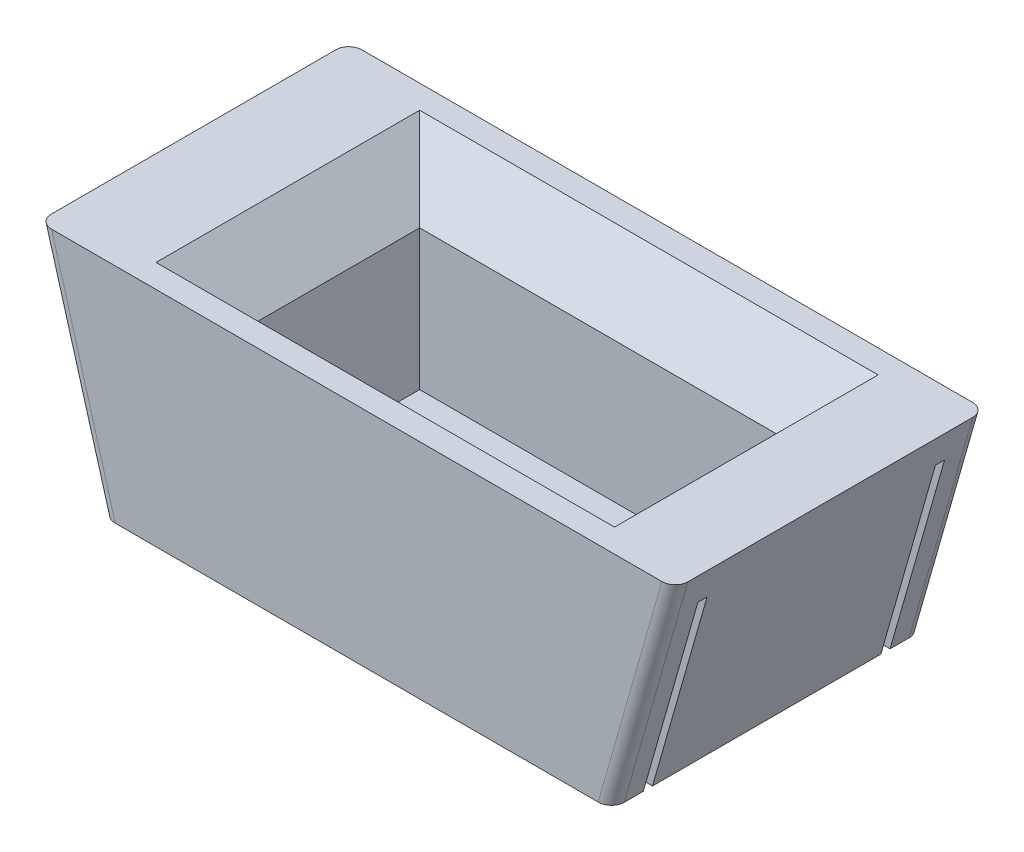
ISO-10303-21;
HEADER;
FILE_DESCRIPTION(('STEP AP214'),'2;1');
FILE_NAME('part.step','',(''),(''),'','','');
FILE_SCHEMA(('AUTOMOTIVE_DESIGN { 1 0 10303 214 1 1 1 1 }'));
ENDSEC;
DATA;
#1=APPLICATION_CONTEXT('core data for automotive mechanical design processes');
#2=APPLICATION_PROTOCOL_DEFINITION('international standard','automotive_design',2000,#1);
#3=PRODUCT_CONTEXT('',#1,'mechanical');
#4=PRODUCT('Part','Part','',(#3));
#5=PRODUCT_RELATED_PRODUCT_CATEGORY('part','',(#4));
#6=PRODUCT_DEFINITION_FORMATION('','',#4);
#7=PRODUCT_DEFINITION_CONTEXT('part definition',#1,'design');
#8=PRODUCT_DEFINITION('design','',#6,#7);
#9=PRODUCT_DEFINITION_SHAPE('','',#8);
#10=(LENGTH_UNIT() NAMED_UNIT(*) SI_UNIT(.MILLI.,.METRE.));
#11=(NAMED_UNIT(*) PLANE_ANGLE_UNIT() SI_UNIT($,.RADIAN.));
#12=(NAMED_UNIT(*) SI_UNIT($,.STERADIAN.) SOLID_ANGLE_UNIT());
#13=UNCERTAINTY_MEASURE_WITH_UNIT(LENGTH_MEASURE(1.E-05),#10,'distance_accuracy_value','');
#14=(GEOMETRIC_REPRESENTATION_CONTEXT(3) GLOBAL_UNCERTAINTY_ASSIGNED_CONTEXT((#13)) GLOBAL_UNIT_ASSIGNED_CONTEXT((#10,
#11,#12)) REPRESENTATION_CONTEXT('',''));
#15=CARTESIAN_POINT('',(0.,0.,0.));
#16=DIRECTION('',(0.,0.,1.));
#17=DIRECTION('',(1.,0.,0.));
#18=AXIS2_PLACEMENT_3D('',#15,#16,#17);
#19=CARTESIAN_POINT('',(0.,0.,0.));
#20=DIRECTION('',(0.,1.,0.));
#21=DIRECTION('',(0.,0.,1.));
#22=AXIS2_PLACEMENT_3D('',#19,#20,#21);
#23=PLANE('',#22);
#24=DIRECTION('',(0.,0.,1.));
#25=VECTOR('',#24,1.);
#26=CARTESIAN_POINT('',(-7.7566470171623,0.,11.5914147439107));
#27=LINE('',#26,#25);
#28=CARTESIAN_POINT('',(-7.7566470171623,0.,-14.1314147439107));
#29=VERTEX_POINT('',#28);
#30=CARTESIAN_POINT('',(-7.7566470171623,0.,14.1314147439107));
#31=VERTEX_POINT('',#30);
#32=EDGE_CURVE('E495',#29,#31,#27,.T.);
#33=ORIENTED_EDGE('',*,*,#32,.T.);
#34=DIRECTION('',(1.,0.,0.));
#35=VECTOR('',#34,1.);
#36=CARTESIAN_POINT('',(0.,0.,14.1314147439107));
#37=LINE('',#36,#35);
#38=CARTESIAN_POINT('',(32.766,0.,14.1314147439107));
#39=VERTEX_POINT('',#38);
#40=EDGE_CURVE('E498',#31,#39,#37,.T.);
#41=ORIENTED_EDGE('',*,*,#40,.T.);
#42=DIRECTION('',(0.,0.,-1.));
#43=VECTOR('',#42,1.);
#44=CARTESIAN_POINT('',(32.766,0.,0.));
#45=LINE('',#44,#43);
#46=CARTESIAN_POINT('',(32.766,0.,-14.1314147439107));
#47=VERTEX_POINT('',#46);
#48=EDGE_CURVE('E492',#39,#47,#45,.T.);
#49=ORIENTED_EDGE('',*,*,#48,.T.);
#50=DIRECTION('',(-1.,0.,0.));
#51=VECTOR('',#50,1.);
#52=CARTESIAN_POINT('',(-5.21664701716227,0.,-14.1314147439107));
#53=LINE('',#52,#51);
#54=EDGE_CURVE('E489',#47,#29,#53,.T.);
#55=ORIENTED_EDGE('',*,*,#54,.T.);
#56=EDGE_LOOP('',(#33,#41,#49,#55));
#57=FACE_BOUND('',#56,.T.);
#58=DIRECTION('',(1.,0.,0.));
#59=VECTOR('',#58,1.);
#60=CARTESIAN_POINT('',(0.,0.,22.7711));
#61=LINE('',#60,#59);
#62=CARTESIAN_POINT('',(-50.7954767943513,0.,22.7711));
#63=VERTEX_POINT('',#62);
#64=CARTESIAN_POINT('',(50.7954767943513,0.,22.7711));
#65=VERTEX_POINT('',#64);
#66=EDGE_CURVE('E328',#63,#65,#61,.T.);
#67=ORIENTED_EDGE('',*,*,#66,.F.);
#68=DIRECTION('',(0.,0.,1.));
#69=VECTOR('',#68,1.);
#70=CARTESIAN_POINT('',(-50.7954767943513,0.,-30.9626));
#71=LINE('',#70,#69);
#72=CARTESIAN_POINT('',(-50.7954767943513,0.,-22.7711));
#73=VERTEX_POINT('',#72);
#74=EDGE_CURVE('E538',#73,#63,#71,.T.);
#75=ORIENTED_EDGE('',*,*,#74,.F.);
#76=DIRECTION('',(1.,0.,0.));
#77=VECTOR('',#76,1.);
#78=CARTESIAN_POINT('',(0.,0.,-22.7711));
#79=LINE('',#78,#77);
#80=CARTESIAN_POINT('',(50.7954767943513,0.,-22.7711));
#81=VERTEX_POINT('',#80);
#82=EDGE_CURVE('E350',#73,#81,#79,.T.);
#83=ORIENTED_EDGE('',*,*,#82,.T.);
#84=DIRECTION('',(0.,0.,1.));
#85=VECTOR('',#84,1.);
#86=CARTESIAN_POINT('',(50.7954767943513,0.,-30.9626));
#87=LINE('',#86,#85);
#88=EDGE_CURVE('E543',#81,#65,#87,.T.);
#89=ORIENTED_EDGE('',*,*,#88,.T.);
#90=EDGE_LOOP('',(#67,#75,#83,#89));
#91=FACE_BOUND('',#90,.T.);
#92=ADVANCED_FACE('F77',(#57,#91),#23,.F.);
#93=DIRECTION('',(1.,0.,0.));
#94=VECTOR('',#93,1.);
#95=CARTESIAN_POINT('',(0.,0.,30.9626));
#96=LINE('',#95,#94);
#97=CARTESIAN_POINT('',(-48.1537659016846,0.,30.9626));
#98=VERTEX_POINT('',#97);
#99=CARTESIAN_POINT('',(48.1537659016846,0.,30.9626));
#100=VERTEX_POINT('',#99);
#101=EDGE_CURVE('E349',#98,#100,#96,.T.);
#102=ORIENTED_EDGE('',*,*,#101,.F.);
#103=CARTESIAN_POINT('',(-48.1537659016846,0.,28.4226));
#104=DIRECTION('',(0.,1.,0.));
#105=DIRECTION('',(-1.,0.,0.));
#106=AXIS2_PLACEMENT_3D('',#103,#104,#105);
#107=ELLIPSE('',#106,2.64171089266669,2.54);
#108=CARTESIAN_POINT('',(-50.7954767943513,0.,28.4226));
#109=VERTEX_POINT('',#108);
#110=EDGE_CURVE('E466',#98,#109,#107,.F.);
#111=ORIENTED_EDGE('',*,*,#110,.T.);
#112=CARTESIAN_POINT('',(-50.7954767943513,0.,24.6126));
#113=VERTEX_POINT('',#112);
#114=EDGE_CURVE('E539',#113,#109,#71,.T.);
#115=ORIENTED_EDGE('',*,*,#114,.F.);
#116=DIRECTION('',(1.,0.,0.));
#117=VECTOR('',#116,1.);
#118=CARTESIAN_POINT('',(0.,0.,24.6126));
#119=LINE('',#118,#117);
#120=CARTESIAN_POINT('',(50.7954767943513,0.,24.6126));
#121=VERTEX_POINT('',#120);
#122=EDGE_CURVE('E362',#113,#121,#119,.T.);
#123=ORIENTED_EDGE('',*,*,#122,.T.);
#124=CARTESIAN_POINT('',(50.7954767943513,0.,28.4226));
#125=VERTEX_POINT('',#124);
#126=EDGE_CURVE('E533',#121,#125,#87,.T.);
#127=ORIENTED_EDGE('',*,*,#126,.T.);
#128=CARTESIAN_POINT('',(48.1537659016846,0.,28.4226));
#129=DIRECTION('',(0.,1.,0.));
#130=DIRECTION('',(-1.,0.,0.));
#131=AXIS2_PLACEMENT_3D('',#128,#129,#130);
#132=ELLIPSE('',#131,2.64171089266669,2.54);
#133=EDGE_CURVE('E463',#125,#100,#132,.F.);
#134=ORIENTED_EDGE('',*,*,#133,.T.);
#135=EDGE_LOOP('',(#102,#111,#115,#123,#127,#134));
#136=FACE_BOUND('',#135,.T.);
#137=ADVANCED_FACE('F595',(#136),#23,.F.);
#138=CARTESIAN_POINT('',(0.,44.45,-30.9626));
#139=DIRECTION('',(0.,0.,-1.));
#140=DIRECTION('',(-1.,0.,0.));
#141=AXIS2_PLACEMENT_3D('',#138,#139,#140);
#142=PLANE('',#141);
#143=DIRECTION('',(1.,0.,0.));
#144=VECTOR('',#143,1.);
#145=CARTESIAN_POINT('',(0.,0.,-30.9626));
#146=LINE('',#145,#144);
#147=CARTESIAN_POINT('',(-48.1537659016846,0.,-30.9626));
#148=VERTEX_POINT('',#147);
#149=CARTESIAN_POINT('',(48.1537659016846,0.,-30.9626));
#150=VERTEX_POINT('',#149);
#151=EDGE_CURVE('E377',#148,#150,#146,.T.);
#152=ORIENTED_EDGE('',*,*,#151,.F.);
#153=DIRECTION('',(-0.27481158389579,0.961498098467536,0.));
#154=VECTOR('',#153,1.);
#155=CARTESIAN_POINT('',(-61.0577948298924,45.1480214230953,-30.9626));
#156=LINE('',#155,#154);
#157=CARTESIAN_POINT('',(-60.8582891073333,44.45,-30.9626));
#158=VERTEX_POINT('',#157);
#159=EDGE_CURVE('E472',#148,#158,#156,.T.);
#160=ORIENTED_EDGE('',*,*,#159,.T.);
#161=DIRECTION('',(1.,0.,0.));
#162=VECTOR('',#161,1.);
#163=CARTESIAN_POINT('',(0.,44.45,-30.9626));
#164=LINE('',#163,#162);
#165=CARTESIAN_POINT('',(60.8582891073333,44.45,-30.9626));
#166=VERTEX_POINT('',#165);
#167=EDGE_CURVE('E376',#158,#166,#164,.T.);
#168=ORIENTED_EDGE('',*,*,#167,.T.);
#169=DIRECTION('',(0.274811583895791,0.961498098467536,0.));
#170=VECTOR('',#169,1.);
#171=CARTESIAN_POINT('',(56.2621855080421,28.3693646482017,-30.9626));
#172=LINE('',#171,#170);
#173=EDGE_CURVE('E469',#166,#150,#172,.F.);
#174=ORIENTED_EDGE('',*,*,#173,.T.);
#175=EDGE_LOOP('',(#152,#160,#168,#174));
#176=FACE_BOUND('',#175,.T.);
#177=ADVANCED_FACE('F643',(#176),#142,.T.);
#178=CARTESIAN_POINT('',(-50.7954767943513,0.,-28.4226));
#179=VERTEX_POINT('',#178);
#180=CARTESIAN_POINT('',(-50.7954767943513,0.,-24.6126));
#181=VERTEX_POINT('',#180);
#182=EDGE_CURVE('E534',#179,#181,#71,.T.);
#183=ORIENTED_EDGE('',*,*,#182,.F.);
#184=CARTESIAN_POINT('',(-48.1537659016846,0.,-28.4226));
#185=DIRECTION('',(0.,1.,0.));
#186=DIRECTION('',(1.,0.,0.));
#187=AXIS2_PLACEMENT_3D('',#184,#185,#186);
#188=ELLIPSE('',#187,2.64171089266669,2.54);
#189=EDGE_CURVE('E479',#179,#148,#188,.F.);
#190=ORIENTED_EDGE('',*,*,#189,.T.);
#191=ORIENTED_EDGE('',*,*,#151,.T.);
#192=CARTESIAN_POINT('',(48.1537659016846,0.,-28.4226));
#193=DIRECTION('',(0.,1.,0.));
#194=DIRECTION('',(1.,0.,0.));
#195=AXIS2_PLACEMENT_3D('',#192,#193,#194);
#196=ELLIPSE('',#195,2.64171089266669,2.54);
#197=CARTESIAN_POINT('',(50.7954767943513,0.,-28.4226));
#198=VERTEX_POINT('',#197);
#199=EDGE_CURVE('E476',#150,#198,#196,.F.);
#200=ORIENTED_EDGE('',*,*,#199,.T.);
#201=CARTESIAN_POINT('',(50.7954767943513,0.,-24.6126));
#202=VERTEX_POINT('',#201);
#203=EDGE_CURVE('E540',#198,#202,#87,.T.);
#204=ORIENTED_EDGE('',*,*,#203,.T.);
#205=DIRECTION('',(1.,0.,0.));
#206=VECTOR('',#205,1.);
#207=CARTESIAN_POINT('',(0.,0.,-24.6126));
#208=LINE('',#207,#206);
#209=EDGE_CURVE('E345',#181,#202,#208,.T.);
#210=ORIENTED_EDGE('',*,*,#209,.F.);
#211=EDGE_LOOP('',(#183,#190,#191,#200,#204,#210));
#212=FACE_BOUND('',#211,.T.);
#213=ADVANCED_FACE('F633',(#212),#23,.F.);
#214=CARTESIAN_POINT('',(0.,44.45,30.9626));
#215=DIRECTION('',(0.,0.,-1.));
#216=DIRECTION('',(-1.,0.,0.));
#217=AXIS2_PLACEMENT_3D('',#214,#215,#216);
#218=PLANE('',#217);
#219=DIRECTION('',(1.,0.,0.));
#220=VECTOR('',#219,1.);
#221=CARTESIAN_POINT('',(0.,44.45,30.9626));
#222=LINE('',#221,#220);
#223=CARTESIAN_POINT('',(-60.8582891073333,44.45,30.9626));
#224=VERTEX_POINT('',#223);
#225=CARTESIAN_POINT('',(60.8582891073333,44.45,30.9626));
#226=VERTEX_POINT('',#225);
#227=EDGE_CURVE('E389',#224,#226,#222,.T.);
#228=ORIENTED_EDGE('',*,*,#227,.F.);
#229=DIRECTION('',(-0.27481158389579,0.961498098467536,0.));
#230=VECTOR('',#229,1.);
#231=CARTESIAN_POINT('',(-56.2621855080421,28.3693646482018,30.9626));
#232=LINE('',#231,#230);
#233=EDGE_CURVE('E460',#224,#98,#232,.F.);
#234=ORIENTED_EDGE('',*,*,#233,.T.);
#235=ORIENTED_EDGE('',*,*,#101,.T.);
#236=DIRECTION('',(0.274811583895791,0.961498098467536,0.));
#237=VECTOR('',#236,1.);
#238=CARTESIAN_POINT('',(61.0577948298925,45.1480214230953,30.9626));
#239=LINE('',#238,#237);
#240=EDGE_CURVE('E456',#100,#226,#239,.T.);
#241=ORIENTED_EDGE('',*,*,#240,.T.);
#242=EDGE_LOOP('',(#228,#234,#235,#241));
#243=FACE_BOUND('',#242,.T.);
#244=ADVANCED_FACE('F603',(#243),#218,.F.);
#245=CARTESIAN_POINT('',(0.,38.1,22.7711));
#246=DIRECTION('',(0.,0.,-1.));
#247=DIRECTION('',(-1.,0.,0.));
#248=AXIS2_PLACEMENT_3D('',#245,#246,#247);
#249=PLANE('',#248);
#250=DIRECTION('',(1.,0.,0.));
#251=VECTOR('',#250,1.);
#252=CARTESIAN_POINT('',(0.,38.1,22.7711));
#253=LINE('',#252,#251);
#254=CARTESIAN_POINT('',(-61.6850681134787,38.1,22.7711));
#255=VERTEX_POINT('',#254);
#256=CARTESIAN_POINT('',(61.6850681134788,38.1,22.7711));
#257=VERTEX_POINT('',#256);
#258=EDGE_CURVE('E358',#255,#257,#253,.T.);
#259=ORIENTED_EDGE('',*,*,#258,.F.);
#260=DIRECTION('',(0.27481158389579,-0.961498098467536,0.));
#261=VECTOR('',#260,1.);
#262=CARTESIAN_POINT('',(-57.0265250006602,21.8009041572915,22.7711));
#263=LINE('',#262,#261);
#264=EDGE_CURVE('E303',#255,#63,#263,.T.);
#265=ORIENTED_EDGE('',*,*,#264,.T.);
#266=ORIENTED_EDGE('',*,*,#66,.T.);
#267=DIRECTION('',(-0.274811583895791,-0.961498098467536,0.));
#268=VECTOR('',#267,1.);
#269=CARTESIAN_POINT('',(57.0265250006602,21.8009041572915,22.7711));
#270=LINE('',#269,#268);
#271=EDGE_CURVE('E558',#257,#65,#270,.T.);
#272=ORIENTED_EDGE('',*,*,#271,.F.);
#273=EDGE_LOOP('',(#259,#265,#266,#272));
#274=FACE_BOUND('',#273,.T.);
#275=ADVANCED_FACE('F582',(#274),#249,.F.);
#276=CARTESIAN_POINT('',(0.,38.1,24.6126));
#277=DIRECTION('',(0.,0.,-1.));
#278=DIRECTION('',(-1.,0.,0.));
#279=AXIS2_PLACEMENT_3D('',#276,#277,#278);
#280=PLANE('',#279);
#281=DIRECTION('',(0.27481158389579,-0.961498098467536,0.));
#282=VECTOR('',#281,1.);
#283=CARTESIAN_POINT('',(-57.0265250006602,21.8009041572915,24.6126));
#284=LINE('',#283,#282);
#285=CARTESIAN_POINT('',(-61.6850681134787,38.1,24.6126));
#286=VERTEX_POINT('',#285);
#287=EDGE_CURVE('E571',#286,#113,#284,.T.);
#288=ORIENTED_EDGE('',*,*,#287,.F.);
#289=DIRECTION('',(1.,0.,0.));
#290=VECTOR('',#289,1.);
#291=CARTESIAN_POINT('',(0.,38.1,24.6126));
#292=LINE('',#291,#290);
#293=CARTESIAN_POINT('',(61.6850681134788,38.1,24.6126));
#294=VERTEX_POINT('',#293);
#295=EDGE_CURVE('E354',#286,#294,#292,.T.);
#296=ORIENTED_EDGE('',*,*,#295,.T.);
#297=DIRECTION('',(-0.274811583895791,-0.961498098467536,0.));
#298=VECTOR('',#297,1.);
#299=CARTESIAN_POINT('',(57.0265250006602,21.8009041572915,24.6126));
#300=LINE('',#299,#298);
#301=EDGE_CURVE('E554',#294,#121,#300,.T.);
#302=ORIENTED_EDGE('',*,*,#301,.T.);
#303=ORIENTED_EDGE('',*,*,#122,.F.);
#304=EDGE_LOOP('',(#288,#296,#302,#303));
#305=FACE_BOUND('',#304,.T.);
#306=ADVANCED_FACE('F749',(#305),#280,.T.);
#307=CARTESIAN_POINT('',(0.,38.1,0.));
#308=DIRECTION('',(0.,1.,0.));
#309=DIRECTION('',(0.,0.,1.));
#310=AXIS2_PLACEMENT_3D('',#307,#308,#309);
#311=PLANE('',#310);
#312=ORIENTED_EDGE('',*,*,#295,.F.);
#313=DIRECTION('',(0.,0.,-1.));
#314=VECTOR('',#313,1.);
#315=CARTESIAN_POINT('',(-61.6850681134787,38.1,0.));
#316=LINE('',#315,#314);
#317=EDGE_CURVE('E568',#286,#255,#316,.T.);
#318=ORIENTED_EDGE('',*,*,#317,.T.);
#319=ORIENTED_EDGE('',*,*,#258,.T.);
#320=DIRECTION('',(0.,0.,-1.));
#321=VECTOR('',#320,1.);
#322=CARTESIAN_POINT('',(61.6850681134788,38.1,0.));
#323=LINE('',#322,#321);
#324=EDGE_CURVE('E551',#294,#257,#323,.T.);
#325=ORIENTED_EDGE('',*,*,#324,.F.);
#326=EDGE_LOOP('',(#312,#318,#319,#325));
#327=FACE_BOUND('',#326,.T.);
#328=ADVANCED_FACE('F746',(#327),#311,.F.);
#329=CARTESIAN_POINT('',(0.,38.1,-22.7711));
#330=DIRECTION('',(0.,0.,-1.));
#331=DIRECTION('',(-1.,0.,0.));
#332=AXIS2_PLACEMENT_3D('',#329,#330,#331);
#333=PLANE('',#332);
#334=DIRECTION('',(0.27481158389579,-0.961498098467536,0.));
#335=VECTOR('',#334,1.);
#336=CARTESIAN_POINT('',(-57.0265250006602,21.8009041572915,-22.7711));
#337=LINE('',#336,#335);
#338=CARTESIAN_POINT('',(-61.6850681134787,38.1,-22.7711));
#339=VERTEX_POINT('',#338);
#340=EDGE_CURVE('E565',#339,#73,#337,.T.);
#341=ORIENTED_EDGE('',*,*,#340,.F.);
#342=DIRECTION('',(1.,0.,0.));
#343=VECTOR('',#342,1.);
#344=CARTESIAN_POINT('',(0.,38.1,-22.7711));
#345=LINE('',#344,#343);
#346=CARTESIAN_POINT('',(61.6850681134788,38.1,-22.7711));
#347=VERTEX_POINT('',#346);
#348=EDGE_CURVE('E340',#339,#347,#345,.T.);
#349=ORIENTED_EDGE('',*,*,#348,.T.);
#350=DIRECTION('',(-0.274811583895791,-0.961498098467536,0.));
#351=VECTOR('',#350,1.);
#352=CARTESIAN_POINT('',(57.0265250006602,21.8009041572915,-22.7711));
#353=LINE('',#352,#351);
#354=EDGE_CURVE('E547',#347,#81,#353,.T.);
#355=ORIENTED_EDGE('',*,*,#354,.T.);
#356=ORIENTED_EDGE('',*,*,#82,.F.);
#357=EDGE_LOOP('',(#341,#349,#355,#356));
#358=FACE_BOUND('',#357,.T.);
#359=ADVANCED_FACE('F620',(#358),#333,.T.);
#360=CARTESIAN_POINT('',(0.,38.1,-24.6126));
#361=DIRECTION('',(0.,0.,-1.));
#362=DIRECTION('',(-1.,0.,0.));
#363=AXIS2_PLACEMENT_3D('',#360,#361,#362);
#364=PLANE('',#363);
#365=DIRECTION('',(1.,0.,0.));
#366=VECTOR('',#365,1.);
#367=CARTESIAN_POINT('',(0.,38.1,-24.6126));
#368=LINE('',#367,#366);
#369=CARTESIAN_POINT('',(-61.6850681134787,38.1,-24.6126));
#370=VERTEX_POINT('',#369);
#371=CARTESIAN_POINT('',(61.6850681134788,38.1,-24.6126));
#372=VERTEX_POINT('',#371);
#373=EDGE_CURVE('E344',#370,#372,#368,.T.);
#374=ORIENTED_EDGE('',*,*,#373,.F.);
#375=DIRECTION('',(0.27481158389579,-0.961498098467536,0.));
#376=VECTOR('',#375,1.);
#377=CARTESIAN_POINT('',(-57.0265250006602,21.8009041572915,-24.6126));
#378=LINE('',#377,#376);
#379=EDGE_CURVE('E561',#370,#181,#378,.T.);
#380=ORIENTED_EDGE('',*,*,#379,.T.);
#381=ORIENTED_EDGE('',*,*,#209,.T.);
#382=DIRECTION('',(-0.274811583895791,-0.961498098467536,0.));
#383=VECTOR('',#382,1.);
#384=CARTESIAN_POINT('',(57.0265250006602,21.8009041572915,-24.6126));
#385=LINE('',#384,#383);
#386=EDGE_CURVE('E537',#372,#202,#385,.T.);
#387=ORIENTED_EDGE('',*,*,#386,.F.);
#388=EDGE_LOOP('',(#374,#380,#381,#387));
#389=FACE_BOUND('',#388,.T.);
#390=ADVANCED_FACE('F629',(#389),#364,.F.);
#391=CARTESIAN_POINT('',(0.,38.1,0.));
#392=DIRECTION('',(0.,1.,0.));
#393=DIRECTION('',(0.,0.,1.));
#394=AXIS2_PLACEMENT_3D('',#391,#392,#393);
#395=PLANE('',#394);
#396=ORIENTED_EDGE('',*,*,#348,.F.);
#397=DIRECTION('',(0.,0.,-1.));
#398=VECTOR('',#397,1.);
#399=CARTESIAN_POINT('',(-61.6850681134787,38.1,0.));
#400=LINE('',#399,#398);
#401=EDGE_CURVE('E433',#339,#370,#400,.T.);
#402=ORIENTED_EDGE('',*,*,#401,.T.);
#403=ORIENTED_EDGE('',*,*,#373,.T.);
#404=DIRECTION('',(0.,0.,-1.));
#405=VECTOR('',#404,1.);
#406=CARTESIAN_POINT('',(61.6850681134788,38.1,0.));
#407=LINE('',#406,#405);
#408=EDGE_CURVE('E421',#347,#372,#407,.T.);
#409=ORIENTED_EDGE('',*,*,#408,.F.);
#410=EDGE_LOOP('',(#396,#402,#403,#409));
#411=FACE_BOUND('',#410,.T.);
#412=ADVANCED_FACE('F623',(#411),#395,.F.);
#413=CARTESIAN_POINT('',(0.,44.45,0.));
#414=DIRECTION('',(0.,1.,0.));
#415=DIRECTION('',(0.,0.,1.));
#416=AXIS2_PLACEMENT_3D('',#413,#414,#415);
#417=PLANE('',#416);
#418=DIRECTION('',(-1.,0.,0.));
#419=VECTOR('',#418,1.);
#420=CARTESIAN_POINT('',(-34.544,44.45,26.289));
#421=LINE('',#420,#419);
#422=CARTESIAN_POINT('',(46.736,44.45,26.289));
#423=VERTEX_POINT('',#422);
#424=CARTESIAN_POINT('',(-44.704,44.45,26.289));
#425=VERTEX_POINT('',#424);
#426=EDGE_CURVE('E405',#423,#425,#421,.T.);
#427=ORIENTED_EDGE('',*,*,#426,.T.);
#428=DIRECTION('',(0.,0.,-1.));
#429=VECTOR('',#428,1.);
#430=CARTESIAN_POINT('',(-44.704,44.45,-16.129));
#431=LINE('',#430,#429);
#432=CARTESIAN_POINT('',(-44.704,44.45,-26.289));
#433=VERTEX_POINT('',#432);
#434=EDGE_CURVE('E408',#425,#433,#431,.T.);
#435=ORIENTED_EDGE('',*,*,#434,.T.);
#436=DIRECTION('',(1.,0.,0.));
#437=VECTOR('',#436,1.);
#438=CARTESIAN_POINT('',(36.576,44.45,-26.289));
#439=LINE('',#438,#437);
#440=CARTESIAN_POINT('',(46.736,44.45,-26.289));
#441=VERTEX_POINT('',#440);
#442=EDGE_CURVE('E402',#433,#441,#439,.T.);
#443=ORIENTED_EDGE('',*,*,#442,.T.);
#444=DIRECTION('',(0.,0.,1.));
#445=VECTOR('',#444,1.);
#446=CARTESIAN_POINT('',(46.736,44.45,16.129));
#447=LINE('',#446,#445);
#448=EDGE_CURVE('E399',#441,#423,#447,.T.);
#449=ORIENTED_EDGE('',*,*,#448,.T.);
#450=EDGE_LOOP('',(#427,#435,#443,#449));
#451=FACE_BOUND('',#450,.T.);
#452=DIRECTION('',(0.,0.,-1.));
#453=VECTOR('',#452,1.);
#454=CARTESIAN_POINT('',(-63.5,44.45,0.));
#455=LINE('',#454,#453);
#456=CARTESIAN_POINT('',(-63.5,44.45,28.4226));
#457=VERTEX_POINT('',#456);
#458=CARTESIAN_POINT('',(-63.5,44.45,-28.4226));
#459=VERTEX_POINT('',#458);
#460=EDGE_CURVE('E381',#457,#459,#455,.T.);
#461=ORIENTED_EDGE('',*,*,#460,.F.);
#462=CARTESIAN_POINT('',(-60.8582891073333,44.45,28.4226));
#463=DIRECTION('',(0.,1.,0.));
#464=DIRECTION('',(-1.,0.,0.));
#465=AXIS2_PLACEMENT_3D('',#462,#463,#464);
#466=ELLIPSE('',#465,2.64171089266669,2.54);
#467=EDGE_CURVE('E453',#457,#224,#466,.T.);
#468=ORIENTED_EDGE('',*,*,#467,.T.);
#469=ORIENTED_EDGE('',*,*,#227,.T.);
#470=CARTESIAN_POINT('',(60.8582891073333,44.45,28.4226));
#471=DIRECTION('',(0.,1.,0.));
#472=DIRECTION('',(-1.,0.,0.));
#473=AXIS2_PLACEMENT_3D('',#470,#471,#472);
#474=ELLIPSE('',#473,2.64171089266669,2.54);
#475=CARTESIAN_POINT('',(63.5,44.45,28.4226));
#476=VERTEX_POINT('',#475);
#477=EDGE_CURVE('E444',#226,#476,#474,.T.);
#478=ORIENTED_EDGE('',*,*,#477,.T.);
#479=DIRECTION('',(0.,0.,-1.));
#480=VECTOR('',#479,1.);
#481=CARTESIAN_POINT('',(63.5,44.45,0.));
#482=LINE('',#481,#480);
#483=CARTESIAN_POINT('',(63.5,44.45,-28.4226));
#484=VERTEX_POINT('',#483);
#485=EDGE_CURVE('E372',#476,#484,#482,.T.);
#486=ORIENTED_EDGE('',*,*,#485,.T.);
#487=CARTESIAN_POINT('',(60.8582891073333,44.45,-28.4226));
#488=DIRECTION('',(0.,1.,0.));
#489=DIRECTION('',(1.,0.,0.));
#490=AXIS2_PLACEMENT_3D('',#487,#488,#489);
#491=ELLIPSE('',#490,2.64171089266669,2.54);
#492=EDGE_CURVE('E447',#484,#166,#491,.T.);
#493=ORIENTED_EDGE('',*,*,#492,.T.);
#494=ORIENTED_EDGE('',*,*,#167,.F.);
#495=CARTESIAN_POINT('',(-60.8582891073333,44.45,-28.4226));
#496=DIRECTION('',(0.,1.,0.));
#497=DIRECTION('',(1.,0.,0.));
#498=AXIS2_PLACEMENT_3D('',#495,#496,#497);
#499=ELLIPSE('',#498,2.64171089266669,2.54);
#500=EDGE_CURVE('E450',#158,#459,#499,.T.);
#501=ORIENTED_EDGE('',*,*,#500,.T.);
#502=EDGE_LOOP('',(#461,#468,#469,#478,#486,#493,#494,#501));
#503=FACE_BOUND('',#502,.T.);
#504=ADVANCED_FACE('F607',(#451,#503),#417,.T.);
#505=CARTESIAN_POINT('',(36.576,6.34999999999999,16.129));
#506=DIRECTION('',(1.,0.,0.));
#507=DIRECTION('',(0.,0.,-1.));
#508=AXIS2_PLACEMENT_3D('',#505,#506,#507);
#509=PLANE('',#508);
#510=DIRECTION('',(0.,1.,0.));
#511=VECTOR('',#510,1.);
#512=CARTESIAN_POINT('',(36.576,6.34999999999999,16.129));
#513=LINE('',#512,#511);
#514=CARTESIAN_POINT('',(36.576,6.34999999999999,16.129));
#515=VERTEX_POINT('',#514);
#516=CARTESIAN_POINT('',(36.576,34.29,16.129));
#517=VERTEX_POINT('',#516);
#518=EDGE_CURVE('E324',#515,#517,#513,.T.);
#519=ORIENTED_EDGE('',*,*,#518,.T.);
#520=DIRECTION('',(0.,0.,-1.));
#521=VECTOR('',#520,1.);
#522=CARTESIAN_POINT('',(36.576,34.29,-16.129));
#523=LINE('',#522,#521);
#524=CARTESIAN_POINT('',(36.576,34.29,-16.129));
#525=VERTEX_POINT('',#524);
#526=EDGE_CURVE('E418',#517,#525,#523,.T.);
#527=ORIENTED_EDGE('',*,*,#526,.T.);
#528=DIRECTION('',(0.,1.,0.));
#529=VECTOR('',#528,1.);
#530=CARTESIAN_POINT('',(36.576,6.34999999999999,-16.129));
#531=LINE('',#530,#529);
#532=CARTESIAN_POINT('',(36.576,6.34999999999999,-16.129));
#533=VERTEX_POINT('',#532);
#534=EDGE_CURVE('E323',#533,#525,#531,.T.);
#535=ORIENTED_EDGE('',*,*,#534,.F.);
#536=DIRECTION('',(0.,0.,-1.));
#537=VECTOR('',#536,1.);
#538=CARTESIAN_POINT('',(36.576,6.34999999999999,16.129));
#539=LINE('',#538,#537);
#540=EDGE_CURVE('E286',#515,#533,#539,.T.);
#541=ORIENTED_EDGE('',*,*,#540,.F.);
#542=EDGE_LOOP('',(#519,#527,#535,#541));
#543=FACE_BOUND('',#542,.T.);
#544=ADVANCED_FACE('F725',(#543),#509,.F.);
#545=CARTESIAN_POINT('',(-34.544,6.34999999999999,16.129));
#546=DIRECTION('',(0.,0.,1.));
#547=DIRECTION('',(1.,0.,0.));
#548=AXIS2_PLACEMENT_3D('',#545,#546,#547);
#549=PLANE('',#548);
#550=DIRECTION('',(0.,1.,0.));
#551=VECTOR('',#550,1.);
#552=CARTESIAN_POINT('',(-34.544,6.34999999999999,16.129));
#553=LINE('',#552,#551);
#554=CARTESIAN_POINT('',(-34.544,6.34999999999999,16.129));
#555=VERTEX_POINT('',#554);
#556=CARTESIAN_POINT('',(-34.544,34.29,16.129));
#557=VERTEX_POINT('',#556);
#558=EDGE_CURVE('E329',#555,#557,#553,.T.);
#559=ORIENTED_EDGE('',*,*,#558,.T.);
#560=DIRECTION('',(1.,0.,0.));
#561=VECTOR('',#560,1.);
#562=CARTESIAN_POINT('',(36.576,34.29,16.129));
#563=LINE('',#562,#561);
#564=EDGE_CURVE('E412',#557,#517,#563,.T.);
#565=ORIENTED_EDGE('',*,*,#564,.T.);
#566=ORIENTED_EDGE('',*,*,#518,.F.);
#567=DIRECTION('',(1.,0.,0.));
#568=VECTOR('',#567,1.);
#569=CARTESIAN_POINT('',(-34.544,6.34999999999999,16.129));
#570=LINE('',#569,#568);
#571=EDGE_CURVE('E319',#555,#515,#570,.T.);
#572=ORIENTED_EDGE('',*,*,#571,.F.);
#573=EDGE_LOOP('',(#559,#565,#566,#572));
#574=FACE_BOUND('',#573,.T.);
#575=ADVANCED_FACE('F727',(#574),#549,.F.);
#576=CARTESIAN_POINT('',(-34.544,6.34999999999999,-16.129));
#577=DIRECTION('',(-1.,0.,0.));
#578=DIRECTION('',(0.,0.,1.));
#579=AXIS2_PLACEMENT_3D('',#576,#577,#578);
#580=PLANE('',#579);
#581=DIRECTION('',(0.,1.,0.));
#582=VECTOR('',#581,1.);
#583=CARTESIAN_POINT('',(-34.544,6.34999999999999,-16.129));
#584=LINE('',#583,#582);
#585=CARTESIAN_POINT('',(-34.544,6.34999999999999,-16.129));
#586=VERTEX_POINT('',#585);
#587=CARTESIAN_POINT('',(-34.544,34.29,-16.129));
#588=VERTEX_POINT('',#587);
#589=EDGE_CURVE('E333',#586,#588,#584,.T.);
#590=ORIENTED_EDGE('',*,*,#589,.T.);
#591=DIRECTION('',(0.,0.,1.));
#592=VECTOR('',#591,1.);
#593=CARTESIAN_POINT('',(-34.544,34.29,16.129));
#594=LINE('',#593,#592);
#595=EDGE_CURVE('E385',#588,#557,#594,.T.);
#596=ORIENTED_EDGE('',*,*,#595,.T.);
#597=ORIENTED_EDGE('',*,*,#558,.F.);
#598=DIRECTION('',(0.,0.,1.));
#599=VECTOR('',#598,1.);
#600=CARTESIAN_POINT('',(-34.544,6.34999999999999,-16.129));
#601=LINE('',#600,#599);
#602=EDGE_CURVE('E315',#586,#555,#601,.T.);
#603=ORIENTED_EDGE('',*,*,#602,.F.);
#604=EDGE_LOOP('',(#590,#596,#597,#603));
#605=FACE_BOUND('',#604,.T.);
#606=ADVANCED_FACE('F721',(#605),#580,.F.);
#607=CARTESIAN_POINT('',(-34.544,6.34999999999999,-16.129));
#608=DIRECTION('',(0.,0.,-1.));
#609=DIRECTION('',(-1.,0.,0.));
#610=AXIS2_PLACEMENT_3D('',#607,#608,#609);
#611=PLANE('',#610);
#612=ORIENTED_EDGE('',*,*,#534,.T.);
#613=DIRECTION('',(-1.,0.,0.));
#614=VECTOR('',#613,1.);
#615=CARTESIAN_POINT('',(-34.544,34.29,-16.129));
#616=LINE('',#615,#614);
#617=EDGE_CURVE('E415',#525,#588,#616,.T.);
#618=ORIENTED_EDGE('',*,*,#617,.T.);
#619=ORIENTED_EDGE('',*,*,#589,.F.);
#620=DIRECTION('',(-1.,0.,0.));
#621=VECTOR('',#620,1.);
#622=CARTESIAN_POINT('',(-34.544,6.34999999999999,-16.129));
#623=LINE('',#622,#621);
#624=EDGE_CURVE('E311',#533,#586,#623,.T.);
#625=ORIENTED_EDGE('',*,*,#624,.F.);
#626=EDGE_LOOP('',(#612,#618,#619,#625));
#627=FACE_BOUND('',#626,.T.);
#628=ADVANCED_FACE('F702',(#627),#611,.F.);
#629=CARTESIAN_POINT('',(0.,6.34999999999999,0.));
#630=DIRECTION('',(0.,-1.,0.));
#631=DIRECTION('',(0.,0.,-1.));
#632=AXIS2_PLACEMENT_3D('',#629,#630,#631);
#633=PLANE('',#632);
#634=DIRECTION('',(0.,0.,-1.));
#635=VECTOR('',#634,1.);
#636=CARTESIAN_POINT('',(30.226,6.34999999999999,11.5914147439107));
#637=LINE('',#636,#635);
#638=CARTESIAN_POINT('',(30.226,6.34999999999999,11.5914147439107));
#639=VERTEX_POINT('',#638);
#640=CARTESIAN_POINT('',(30.226,6.34999999999999,-11.5914147439107));
#641=VERTEX_POINT('',#640);
#642=EDGE_CURVE('E269',#639,#641,#637,.T.);
#643=ORIENTED_EDGE('',*,*,#642,.F.);
#644=DIRECTION('',(1.,0.,0.));
#645=VECTOR('',#644,1.);
#646=CARTESIAN_POINT('',(-5.21664701716227,6.34999999999999,11.5914147439107));
#647=LINE('',#646,#645);
#648=CARTESIAN_POINT('',(-5.21664701716227,6.34999999999999,11.5914147439107));
#649=VERTEX_POINT('',#648);
#650=EDGE_CURVE('E280',#649,#639,#647,.T.);
#651=ORIENTED_EDGE('',*,*,#650,.F.);
#652=DIRECTION('',(0.,0.,1.));
#653=VECTOR('',#652,1.);
#654=CARTESIAN_POINT('',(-5.21664701716227,6.34999999999999,11.5914147439107));
#655=LINE('',#654,#653);
#656=CARTESIAN_POINT('',(-5.21664701716227,6.34999999999999,-11.5914147439107));
#657=VERTEX_POINT('',#656);
#658=EDGE_CURVE('E287',#657,#649,#655,.T.);
#659=ORIENTED_EDGE('',*,*,#658,.F.);
#660=DIRECTION('',(-1.,0.,0.));
#661=VECTOR('',#660,1.);
#662=CARTESIAN_POINT('',(-5.21664701716227,6.34999999999999,-11.5914147439107));
#663=LINE('',#662,#661);
#664=EDGE_CURVE('E292',#641,#657,#663,.T.);
#665=ORIENTED_EDGE('',*,*,#664,.F.);
#666=EDGE_LOOP('',(#643,#651,#659,#665));
#667=FACE_BOUND('',#666,.T.);
#668=ORIENTED_EDGE('',*,*,#540,.T.);
#669=ORIENTED_EDGE('',*,*,#624,.T.);
#670=ORIENTED_EDGE('',*,*,#602,.T.);
#671=ORIENTED_EDGE('',*,*,#571,.T.);
#672=EDGE_LOOP('',(#668,#669,#670,#671));
#673=FACE_BOUND('',#672,.T.);
#674=ADVANCED_FACE('F289',(#667,#673),#633,.F.);
#675=CARTESIAN_POINT('',(36.576,34.29,16.129));
#676=DIRECTION('',(-0.707106781186547,0.707106781186548,0.));
#677=DIRECTION('',(0.,0.,1.));
#678=AXIS2_PLACEMENT_3D('',#675,#676,#677);
#679=PLANE('',#678);
#680=DIRECTION('',(0.577350269189626,0.577350269189625,0.577350269189626));
#681=VECTOR('',#680,1.);
#682=CARTESIAN_POINT('',(12.8693333333333,10.5833333333334,-7.5776666666667));
#683=LINE('',#682,#681);
#684=EDGE_CURVE('E300',#423,#517,#683,.F.);
#685=ORIENTED_EDGE('',*,*,#684,.F.);
#686=ORIENTED_EDGE('',*,*,#448,.F.);
#687=DIRECTION('',(-0.577350269189626,-0.577350269189625,0.577350269189626));
#688=VECTOR('',#687,1.);
#689=CARTESIAN_POINT('',(12.8693333333333,10.5833333333334,7.5776666666667));
#690=LINE('',#689,#688);
#691=EDGE_CURVE('E294',#525,#441,#690,.F.);
#692=ORIENTED_EDGE('',*,*,#691,.F.);
#693=ORIENTED_EDGE('',*,*,#526,.F.);
#694=EDGE_LOOP('',(#685,#686,#692,#693));
#695=FACE_BOUND('',#694,.T.);
#696=ADVANCED_FACE('F693',(#695),#679,.T.);
#697=CARTESIAN_POINT('',(-34.544,34.29,-16.129));
#698=DIRECTION('',(0.,0.707106781186548,0.707106781186547));
#699=DIRECTION('',(1.,0.,0.));
#700=AXIS2_PLACEMENT_3D('',#697,#698,#699);
#701=PLANE('',#700);
#702=ORIENTED_EDGE('',*,*,#691,.T.);
#703=ORIENTED_EDGE('',*,*,#442,.F.);
#704=DIRECTION('',(0.577350269189626,-0.577350269189625,0.577350269189626));
#705=VECTOR('',#704,1.);
#706=CARTESIAN_POINT('',(-34.544,34.29,-16.129));
#707=LINE('',#706,#705);
#708=EDGE_CURVE('E425',#588,#433,#707,.F.);
#709=ORIENTED_EDGE('',*,*,#708,.F.);
#710=ORIENTED_EDGE('',*,*,#617,.F.);
#711=EDGE_LOOP('',(#702,#703,#709,#710));
#712=FACE_BOUND('',#711,.T.);
#713=ADVANCED_FACE('F686',(#712),#701,.T.);
#714=CARTESIAN_POINT('',(-34.544,34.29,16.129));
#715=DIRECTION('',(0.,0.707106781186548,-0.707106781186547));
#716=DIRECTION('',(-1.,0.,0.));
#717=AXIS2_PLACEMENT_3D('',#714,#715,#716);
#718=PLANE('',#717);
#719=ORIENTED_EDGE('',*,*,#684,.T.);
#720=ORIENTED_EDGE('',*,*,#564,.F.);
#721=DIRECTION('',(-0.577350269189626,0.577350269189625,0.577350269189626));
#722=VECTOR('',#721,1.);
#723=CARTESIAN_POINT('',(-23.7913333333333,23.5373333333333,5.37633333333332));
#724=LINE('',#723,#722);
#725=EDGE_CURVE('E422',#425,#557,#724,.F.);
#726=ORIENTED_EDGE('',*,*,#725,.F.);
#727=ORIENTED_EDGE('',*,*,#426,.F.);
#728=EDGE_LOOP('',(#719,#720,#726,#727));
#729=FACE_BOUND('',#728,.T.);
#730=ADVANCED_FACE('F679',(#729),#718,.T.);
#731=CARTESIAN_POINT('',(-34.544,34.29,-16.129));
#732=DIRECTION('',(0.707106781186547,0.707106781186548,0.));
#733=DIRECTION('',(0.,0.,-1.));
#734=AXIS2_PLACEMENT_3D('',#731,#732,#733);
#735=PLANE('',#734);
#736=ORIENTED_EDGE('',*,*,#708,.T.);
#737=ORIENTED_EDGE('',*,*,#434,.F.);
#738=ORIENTED_EDGE('',*,*,#725,.T.);
#739=ORIENTED_EDGE('',*,*,#595,.F.);
#740=EDGE_LOOP('',(#736,#737,#738,#739));
#741=FACE_BOUND('',#740,.T.);
#742=ADVANCED_FACE('F673',(#741),#735,.T.);
#743=CARTESIAN_POINT('',(46.9593309357241,-13.4217302495983,-30.9626));
#744=DIRECTION('',(0.961498098467536,-0.274811583895791,0.));
#745=DIRECTION('',(0.274811583895791,0.961498098467536,0.));
#746=AXIS2_PLACEMENT_3D('',#743,#744,#745);
#747=PLANE('',#746);
#748=ORIENTED_EDGE('',*,*,#203,.F.);
#749=DIRECTION('',(0.274811583895791,0.961498098467536,0.));
#750=VECTOR('',#749,1.);
#751=CARTESIAN_POINT('',(46.9593309357241,-13.4217302495983,-28.4226));
#752=LINE('',#751,#750);
#753=EDGE_CURVE('E485',#198,#484,#752,.T.);
#754=ORIENTED_EDGE('',*,*,#753,.T.);
#755=ORIENTED_EDGE('',*,*,#485,.F.);
#756=DIRECTION('',(0.274811583895791,0.961498098467536,0.));
#757=VECTOR('',#756,1.);
#758=CARTESIAN_POINT('',(50.7954767943513,0.,28.4226));
#759=LINE('',#758,#757);
#760=EDGE_CURVE('E482',#476,#125,#759,.F.);
#761=ORIENTED_EDGE('',*,*,#760,.T.);
#762=ORIENTED_EDGE('',*,*,#126,.F.);
#763=ORIENTED_EDGE('',*,*,#301,.F.);
#764=ORIENTED_EDGE('',*,*,#324,.T.);
#765=ORIENTED_EDGE('',*,*,#271,.T.);
#766=ORIENTED_EDGE('',*,*,#88,.F.);
#767=ORIENTED_EDGE('',*,*,#354,.F.);
#768=ORIENTED_EDGE('',*,*,#408,.T.);
#769=ORIENTED_EDGE('',*,*,#386,.T.);
#770=EDGE_LOOP('',(#748,#754,#755,#761,#762,#763,#764,#765,#766,#767,#768,#769));
#771=FACE_BOUND('',#770,.T.);
#772=ADVANCED_FACE('F627',(#771),#747,.T.);
#773=CARTESIAN_POINT('',(-46.9593309357241,-13.4217302495983,-30.9626));
#774=DIRECTION('',(0.961498098467536,0.27481158389579,0.));
#775=DIRECTION('',(-0.27481158389579,0.961498098467536,0.));
#776=AXIS2_PLACEMENT_3D('',#773,#774,#775);
#777=PLANE('',#776);
#778=ORIENTED_EDGE('',*,*,#114,.T.);
#779=DIRECTION('',(-0.27481158389579,0.961498098467536,0.));
#780=VECTOR('',#779,1.);
#781=CARTESIAN_POINT('',(-46.9593309357241,-13.4217302495983,28.4226));
#782=LINE('',#781,#780);
#783=EDGE_CURVE('E440',#109,#457,#782,.T.);
#784=ORIENTED_EDGE('',*,*,#783,.T.);
#785=ORIENTED_EDGE('',*,*,#460,.T.);
#786=DIRECTION('',(-0.27481158389579,0.961498098467536,0.));
#787=VECTOR('',#786,1.);
#788=CARTESIAN_POINT('',(-50.7954767943513,0.,-28.4226));
#789=LINE('',#788,#787);
#790=EDGE_CURVE('E437',#459,#179,#789,.F.);
#791=ORIENTED_EDGE('',*,*,#790,.T.);
#792=ORIENTED_EDGE('',*,*,#182,.T.);
#793=ORIENTED_EDGE('',*,*,#379,.F.);
#794=ORIENTED_EDGE('',*,*,#401,.F.);
#795=ORIENTED_EDGE('',*,*,#340,.T.);
#796=ORIENTED_EDGE('',*,*,#74,.T.);
#797=ORIENTED_EDGE('',*,*,#264,.F.);
#798=ORIENTED_EDGE('',*,*,#317,.F.);
#799=ORIENTED_EDGE('',*,*,#287,.T.);
#800=EDGE_LOOP('',(#778,#784,#785,#791,#792,#793,#794,#795,#796,#797,#798,#799));
#801=FACE_BOUND('',#800,.T.);
#802=ADVANCED_FACE('F613',(#801),#777,.F.);
#803=CARTESIAN_POINT('',(-44.5171257656166,-12.723708826503,28.4226));
#804=DIRECTION('',(-0.27481158389579,0.961498098467536,0.));
#805=DIRECTION('',(-0.961498098467536,-0.27481158389579,0.));
#806=AXIS2_PLACEMENT_3D('',#803,#804,#805);
#807=CYLINDRICAL_SURFACE('',#806,2.54);
#808=ORIENTED_EDGE('',*,*,#110,.F.);
#809=ORIENTED_EDGE('',*,*,#233,.F.);
#810=ORIENTED_EDGE('',*,*,#467,.F.);
#811=ORIENTED_EDGE('',*,*,#783,.F.);
#812=EDGE_LOOP('',(#808,#809,#810,#811));
#813=FACE_BOUND('',#812,.T.);
#814=ADVANCED_FACE('F612',(#813),#807,.T.);
#815=CARTESIAN_POINT('',(-56.2621855080421,28.3693646482018,-28.4226));
#816=DIRECTION('',(0.27481158389579,-0.961498098467536,0.));
#817=DIRECTION('',(0.961498098467536,0.27481158389579,0.));
#818=AXIS2_PLACEMENT_3D('',#815,#816,#817);
#819=CYLINDRICAL_SURFACE('',#818,2.54);
#820=ORIENTED_EDGE('',*,*,#189,.F.);
#821=ORIENTED_EDGE('',*,*,#790,.F.);
#822=ORIENTED_EDGE('',*,*,#500,.F.);
#823=ORIENTED_EDGE('',*,*,#159,.F.);
#824=EDGE_LOOP('',(#820,#821,#822,#823));
#825=FACE_BOUND('',#824,.T.);
#826=ADVANCED_FACE('F646',(#825),#819,.T.);
#827=CARTESIAN_POINT('',(44.5171257656166,-12.723708826503,-28.4226));
#828=DIRECTION('',(0.274811583895791,0.961498098467536,0.));
#829=DIRECTION('',(-0.961498098467536,0.274811583895791,0.));
#830=AXIS2_PLACEMENT_3D('',#827,#828,#829);
#831=CYLINDRICAL_SURFACE('',#830,2.54);
#832=ORIENTED_EDGE('',*,*,#199,.F.);
#833=ORIENTED_EDGE('',*,*,#173,.F.);
#834=ORIENTED_EDGE('',*,*,#492,.F.);
#835=ORIENTED_EDGE('',*,*,#753,.F.);
#836=EDGE_LOOP('',(#832,#833,#834,#835));
#837=FACE_BOUND('',#836,.T.);
#838=ADVANCED_FACE('F638',(#837),#831,.T.);
#839=CARTESIAN_POINT('',(56.2621855080421,28.3693646482017,28.4226));
#840=DIRECTION('',(-0.274811583895791,-0.961498098467536,0.));
#841=DIRECTION('',(0.961498098467536,-0.274811583895791,0.));
#842=AXIS2_PLACEMENT_3D('',#839,#840,#841);
#843=CYLINDRICAL_SURFACE('',#842,2.54);
#844=ORIENTED_EDGE('',*,*,#133,.F.);
#845=ORIENTED_EDGE('',*,*,#760,.F.);
#846=ORIENTED_EDGE('',*,*,#477,.F.);
#847=ORIENTED_EDGE('',*,*,#240,.F.);
#848=EDGE_LOOP('',(#844,#845,#846,#847));
#849=FACE_BOUND('',#848,.T.);
#850=ADVANCED_FACE('F600',(#849),#843,.T.);
#851=CARTESIAN_POINT('',(-5.21664701716227,0.,11.5914147439107));
#852=DIRECTION('',(1.,0.,0.));
#853=DIRECTION('',(0.,0.,-1.));
#854=AXIS2_PLACEMENT_3D('',#851,#852,#853);
#855=PLANE('',#854);
#856=DIRECTION('',(0.,1.,0.));
#857=VECTOR('',#856,1.);
#858=CARTESIAN_POINT('',(-5.21664701716227,0.,11.5914147439107));
#859=LINE('',#858,#857);
#860=CARTESIAN_POINT('',(-5.21664701716227,2.54000000000003,11.5914147439107));
#861=VERTEX_POINT('',#860);
#862=EDGE_CURVE('E277',#861,#649,#859,.T.);
#863=ORIENTED_EDGE('',*,*,#862,.F.);
#864=DIRECTION('',(0.,0.,-1.));
#865=VECTOR('',#864,1.);
#866=CARTESIAN_POINT('',(-5.21664701716227,2.54000000000003,-11.5914147439107));
#867=LINE('',#866,#865);
#868=CARTESIAN_POINT('',(-5.21664701716227,2.54000000000003,-11.5914147439107));
#869=VERTEX_POINT('',#868);
#870=EDGE_CURVE('E102',#861,#869,#867,.T.);
#871=ORIENTED_EDGE('',*,*,#870,.T.);
#872=DIRECTION('',(0.,1.,0.));
#873=VECTOR('',#872,1.);
#874=CARTESIAN_POINT('',(-5.21664701716227,0.,-11.5914147439107));
#875=LINE('',#874,#873);
#876=EDGE_CURVE('E530',#869,#657,#875,.T.);
#877=ORIENTED_EDGE('',*,*,#876,.T.);
#878=ORIENTED_EDGE('',*,*,#658,.T.);
#879=EDGE_LOOP('',(#863,#871,#877,#878));
#880=FACE_BOUND('',#879,.T.);
#881=ADVANCED_FACE('F850',(#880),#855,.T.);
#882=CARTESIAN_POINT('',(-5.21664701716227,0.,-11.5914147439107));
#883=DIRECTION('',(0.,0.,1.));
#884=DIRECTION('',(1.,0.,0.));
#885=AXIS2_PLACEMENT_3D('',#882,#883,#884);
#886=PLANE('',#885);
#887=ORIENTED_EDGE('',*,*,#876,.F.);
#888=DIRECTION('',(1.,0.,0.));
#889=VECTOR('',#888,1.);
#890=CARTESIAN_POINT('',(30.226,2.54000000000003,-11.5914147439107));
#891=LINE('',#890,#889);
#892=CARTESIAN_POINT('',(30.226,2.54000000000003,-11.5914147439107));
#893=VERTEX_POINT('',#892);
#894=EDGE_CURVE('E12',#869,#893,#891,.T.);
#895=ORIENTED_EDGE('',*,*,#894,.T.);
#896=DIRECTION('',(0.,1.,0.));
#897=VECTOR('',#896,1.);
#898=CARTESIAN_POINT('',(30.226,0.,-11.5914147439107));
#899=LINE('',#898,#897);
#900=EDGE_CURVE('E276',#893,#641,#899,.T.);
#901=ORIENTED_EDGE('',*,*,#900,.T.);
#902=ORIENTED_EDGE('',*,*,#664,.T.);
#903=EDGE_LOOP('',(#887,#895,#901,#902));
#904=FACE_BOUND('',#903,.T.);
#905=ADVANCED_FACE('F859',(#904),#886,.T.);
#906=CARTESIAN_POINT('',(30.226,0.,11.5914147439107));
#907=DIRECTION('',(1.,0.,0.));
#908=DIRECTION('',(0.,0.,-1.));
#909=AXIS2_PLACEMENT_3D('',#906,#907,#908);
#910=PLANE('',#909);
#911=ORIENTED_EDGE('',*,*,#900,.F.);
#912=DIRECTION('',(0.,0.,1.));
#913=VECTOR('',#912,1.);
#914=CARTESIAN_POINT('',(30.226,2.54000000000003,11.5914147439107));
#915=LINE('',#914,#913);
#916=CARTESIAN_POINT('',(30.226,2.54000000000003,11.5914147439107));
#917=VERTEX_POINT('',#916);
#918=EDGE_CURVE('E88',#893,#917,#915,.T.);
#919=ORIENTED_EDGE('',*,*,#918,.T.);
#920=DIRECTION('',(0.,1.,0.));
#921=VECTOR('',#920,1.);
#922=CARTESIAN_POINT('',(30.226,0.,11.5914147439107));
#923=LINE('',#922,#921);
#924=EDGE_CURVE('E265',#917,#639,#923,.T.);
#925=ORIENTED_EDGE('',*,*,#924,.T.);
#926=ORIENTED_EDGE('',*,*,#642,.T.);
#927=EDGE_LOOP('',(#911,#919,#925,#926));
#928=FACE_BOUND('',#927,.T.);
#929=ADVANCED_FACE('F267',(#928),#910,.F.);
#930=CARTESIAN_POINT('',(-5.21664701716227,0.,11.5914147439107));
#931=DIRECTION('',(0.,0.,1.));
#932=DIRECTION('',(1.,0.,0.));
#933=AXIS2_PLACEMENT_3D('',#930,#931,#932);
#934=PLANE('',#933);
#935=ORIENTED_EDGE('',*,*,#924,.F.);
#936=DIRECTION('',(-1.,0.,0.));
#937=VECTOR('',#936,1.);
#938=CARTESIAN_POINT('',(-5.21664701716227,2.54000000000003,11.5914147439107));
#939=LINE('',#938,#937);
#940=EDGE_CURVE('E502',#917,#861,#939,.T.);
#941=ORIENTED_EDGE('',*,*,#940,.T.);
#942=ORIENTED_EDGE('',*,*,#862,.T.);
#943=ORIENTED_EDGE('',*,*,#650,.T.);
#944=EDGE_LOOP('',(#935,#941,#942,#943));
#945=FACE_BOUND('',#944,.T.);
#946=ADVANCED_FACE('F281',(#945),#934,.F.);
#947=CARTESIAN_POINT('',(-5.21664701716227,2.54000000000003,-11.5914147439107));
#948=DIRECTION('',(0.,-0.707106781186547,0.707106781186547));
#949=DIRECTION('',(-1.,0.,0.));
#950=AXIS2_PLACEMENT_3D('',#947,#948,#949);
#951=PLANE('',#950);
#952=DIRECTION('',(0.577350269189626,-0.577350269189626,-0.577350269189626));
#953=VECTOR('',#952,1.);
#954=CARTESIAN_POINT('',(28.0555284186964,4.71047158130358,-9.42094316260716));
#955=LINE('',#954,#953);
#956=EDGE_CURVE('E514',#893,#47,#955,.T.);
#957=ORIENTED_EDGE('',*,*,#956,.F.);
#958=ORIENTED_EDGE('',*,*,#894,.F.);
#959=DIRECTION('',(-0.577350269189626,-0.577350269189626,-0.577350269189626));
#960=VECTOR('',#959,1.);
#961=CARTESIAN_POINT('',(2.51096281211154,10.2676098292738,-3.8638049146369));
#962=LINE('',#961,#960);
#963=EDGE_CURVE('E82',#29,#869,#962,.F.);
#964=ORIENTED_EDGE('',*,*,#963,.F.);
#965=ORIENTED_EDGE('',*,*,#54,.F.);
#966=EDGE_LOOP('',(#957,#958,#964,#965));
#967=FACE_BOUND('',#966,.T.);
#968=ADVANCED_FACE('F80',(#967),#951,.T.);
#969=CARTESIAN_POINT('',(-5.21664701716227,2.54000000000003,11.5914147439107));
#970=DIRECTION('',(0.707106781186547,-0.707106781186547,0.));
#971=DIRECTION('',(0.,0.,1.));
#972=AXIS2_PLACEMENT_3D('',#969,#970,#971);
#973=PLANE('',#972);
#974=ORIENTED_EDGE('',*,*,#963,.T.);
#975=ORIENTED_EDGE('',*,*,#870,.F.);
#976=DIRECTION('',(0.577350269189626,0.577350269189626,-0.577350269189626));
#977=VECTOR('',#976,1.);
#978=CARTESIAN_POINT('',(-5.17109801144153,2.58554900572077,11.54586573819));
#979=LINE('',#978,#977);
#980=EDGE_CURVE('E512',#31,#861,#979,.T.);
#981=ORIENTED_EDGE('',*,*,#980,.F.);
#982=ORIENTED_EDGE('',*,*,#32,.F.);
#983=EDGE_LOOP('',(#974,#975,#981,#982));
#984=FACE_BOUND('',#983,.T.);
#985=ADVANCED_FACE('F892',(#984),#973,.T.);
#986=CARTESIAN_POINT('',(32.766,0.,0.));
#987=DIRECTION('',(0.707106781186547,0.707106781186547,0.));
#988=DIRECTION('',(0.,0.,-1.));
#989=AXIS2_PLACEMENT_3D('',#986,#987,#988);
#990=PLANE('',#989);
#991=ORIENTED_EDGE('',*,*,#956,.T.);
#992=ORIENTED_EDGE('',*,*,#48,.F.);
#993=DIRECTION('',(-0.577350269189626,0.577350269189626,-0.577350269189626));
#994=VECTOR('',#993,1.);
#995=CARTESIAN_POINT('',(21.844,10.922,3.20941474391073));
#996=LINE('',#995,#994);
#997=EDGE_CURVE('E509',#917,#39,#996,.F.);
#998=ORIENTED_EDGE('',*,*,#997,.F.);
#999=ORIENTED_EDGE('',*,*,#918,.F.);
#1000=EDGE_LOOP('',(#991,#992,#998,#999));
#1001=FACE_BOUND('',#1000,.T.);
#1002=ADVANCED_FACE('F901',(#1001),#990,.F.);
#1003=CARTESIAN_POINT('',(0.,0.,14.1314147439107));
#1004=DIRECTION('',(0.,0.707106781186547,0.707106781186547));
#1005=DIRECTION('',(1.,0.,0.));
#1006=AXIS2_PLACEMENT_3D('',#1003,#1004,#1005);
#1007=PLANE('',#1006);
#1008=ORIENTED_EDGE('',*,*,#980,.T.);
#1009=ORIENTED_EDGE('',*,*,#940,.F.);
#1010=ORIENTED_EDGE('',*,*,#997,.T.);
#1011=ORIENTED_EDGE('',*,*,#40,.F.);
#1012=EDGE_LOOP('',(#1008,#1009,#1010,#1011));
#1013=FACE_BOUND('',#1012,.T.);
#1014=ADVANCED_FACE('F909',(#1013),#1007,.F.);
#1015=CLOSED_SHELL('',(#92,#137,#177,#213,#244,#275,#306,#328,#359,#390,#412,#504,#544,#575,
#606,#628,#674,#696,#713,#730,#742,#772,#802,#814,#826,#838,#850,#881,#905,#929,#946,#968,#985,
#1002,#1014));
#1016=MANIFOLD_SOLID_BREP('B2',#1015);
#1017=ADVANCED_BREP_SHAPE_REPRESENTATION('',(#18,#1016),#14);
#1018=SHAPE_DEFINITION_REPRESENTATION(#9,#1017);
ENDSEC;
END-ISO-10303-21;
